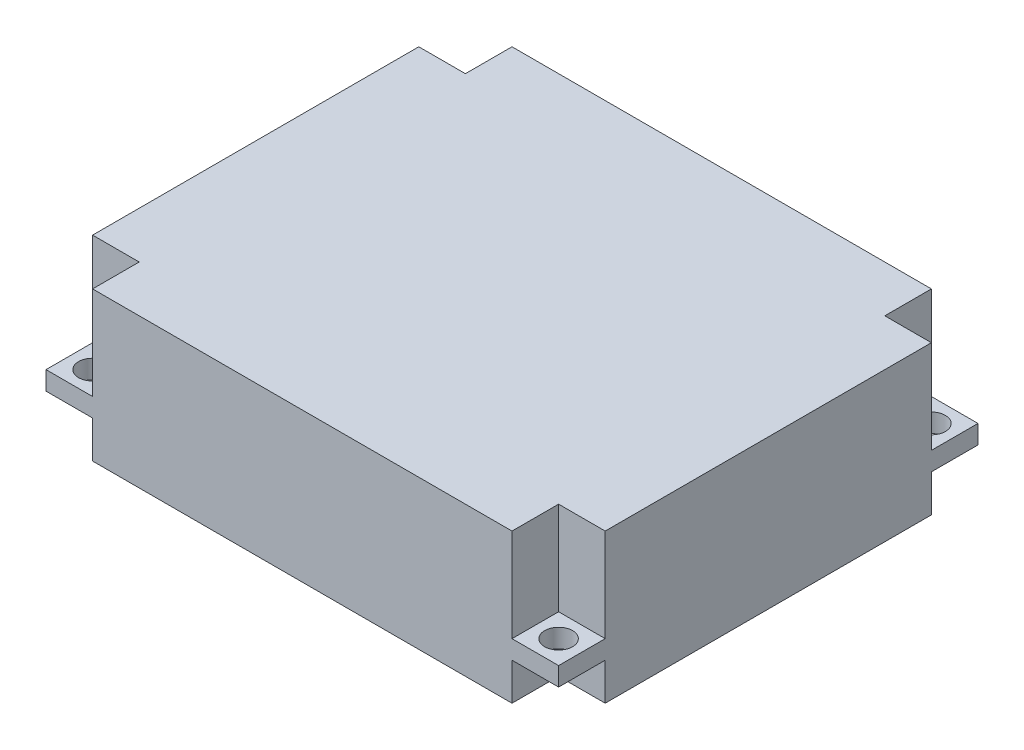
ISO-10303-21;
HEADER;
FILE_DESCRIPTION(('STEP AP214'),'2;1');
FILE_NAME('part.step','',(''),(''),'','','');
FILE_SCHEMA(('AUTOMOTIVE_DESIGN { 1 0 10303 214 1 1 1 1 }'));
ENDSEC;
DATA;
#1=APPLICATION_CONTEXT('core data for automotive mechanical design processes');
#2=APPLICATION_PROTOCOL_DEFINITION('international standard','automotive_design',2000,#1);
#3=PRODUCT_CONTEXT('',#1,'mechanical');
#4=PRODUCT('Part','Part','',(#3));
#5=PRODUCT_RELATED_PRODUCT_CATEGORY('part','',(#4));
#6=PRODUCT_DEFINITION_FORMATION('','',#4);
#7=PRODUCT_DEFINITION_CONTEXT('part definition',#1,'design');
#8=PRODUCT_DEFINITION('design','',#6,#7);
#9=PRODUCT_DEFINITION_SHAPE('','',#8);
#10=(LENGTH_UNIT() NAMED_UNIT(*) SI_UNIT(.MILLI.,.METRE.));
#11=(NAMED_UNIT(*) PLANE_ANGLE_UNIT() SI_UNIT($,.RADIAN.));
#12=(NAMED_UNIT(*) SI_UNIT($,.STERADIAN.) SOLID_ANGLE_UNIT());
#13=UNCERTAINTY_MEASURE_WITH_UNIT(LENGTH_MEASURE(1.E-05),#10,'distance_accuracy_value','');
#14=(GEOMETRIC_REPRESENTATION_CONTEXT(3) GLOBAL_UNCERTAINTY_ASSIGNED_CONTEXT((#13)) GLOBAL_UNIT_ASSIGNED_CONTEXT((#10,
#11,#12)) REPRESENTATION_CONTEXT('',''));
#15=CARTESIAN_POINT('',(0.,0.,0.));
#16=DIRECTION('',(0.,0.,1.));
#17=DIRECTION('',(1.,0.,0.));
#18=AXIS2_PLACEMENT_3D('',#15,#16,#17);
#19=CARTESIAN_POINT('',(0.,2.,0.));
#20=DIRECTION('',(0.,1.,0.));
#21=DIRECTION('',(0.,0.,1.));
#22=AXIS2_PLACEMENT_3D('',#19,#20,#21);
#23=PLANE('',#22);
#24=DIRECTION('',(-1.,0.,0.));
#25=VECTOR('',#24,1.);
#26=CARTESIAN_POINT('',(0.,2.,-17.5));
#27=LINE('',#26,#25);
#28=CARTESIAN_POINT('',(-22.5,2.,-17.5));
#29=VERTEX_POINT('',#28);
#30=CARTESIAN_POINT('',(-27.5,2.,-17.5));
#31=VERTEX_POINT('',#30);
#32=EDGE_CURVE('E54',#29,#31,#27,.T.);
#33=ORIENTED_EDGE('',*,*,#32,.F.);
#34=DIRECTION('',(0.,0.,1.));
#35=VECTOR('',#34,1.);
#36=CARTESIAN_POINT('',(-22.5,2.,0.));
#37=LINE('',#36,#35);
#38=CARTESIAN_POINT('',(-22.5,2.,-22.5));
#39=VERTEX_POINT('',#38);
#40=EDGE_CURVE('E367',#39,#29,#37,.T.);
#41=ORIENTED_EDGE('',*,*,#40,.F.);
#42=DIRECTION('',(-1.,0.,0.));
#43=VECTOR('',#42,1.);
#44=CARTESIAN_POINT('',(-27.5,2.,-22.5));
#45=LINE('',#44,#43);
#46=CARTESIAN_POINT('',(-27.5,2.,-22.5));
#47=VERTEX_POINT('',#46);
#48=EDGE_CURVE('E403',#39,#47,#45,.T.);
#49=ORIENTED_EDGE('',*,*,#48,.T.);
#50=DIRECTION('',(0.,0.,1.));
#51=VECTOR('',#50,1.);
#52=CARTESIAN_POINT('',(-27.5,2.,-22.5));
#53=LINE('',#52,#51);
#54=EDGE_CURVE('E395',#47,#31,#53,.T.);
#55=ORIENTED_EDGE('',*,*,#54,.T.);
#56=EDGE_LOOP('',(#33,#41,#49,#55));
#57=FACE_BOUND('',#56,.T.);
#58=CARTESIAN_POINT('',(-25.,2.,-20.));
#59=DIRECTION('',(0.,1.,0.));
#60=DIRECTION('',(0.,0.,1.));
#61=AXIS2_PLACEMENT_3D('',#58,#59,#60);
#62=CIRCLE('',#61,1.5);
#63=CARTESIAN_POINT('',(-25.,2.,-18.5));
#64=VERTEX_POINT('',#63);
#65=EDGE_CURVE('E391',#64,#64,#62,.T.);
#66=ORIENTED_EDGE('',*,*,#65,.F.);
#67=EDGE_LOOP('',(#66));
#68=FACE_BOUND('',#67,.T.);
#69=ADVANCED_FACE('F39',(#57,#68),#23,.T.);
#70=DIRECTION('',(0.,0.,-1.));
#71=VECTOR('',#70,1.);
#72=CARTESIAN_POINT('',(22.5,2.,0.));
#73=LINE('',#72,#71);
#74=CARTESIAN_POINT('',(22.5,2.,-17.5));
#75=VERTEX_POINT('',#74);
#76=CARTESIAN_POINT('',(22.5,2.,-22.5));
#77=VERTEX_POINT('',#76);
#78=EDGE_CURVE('E62',#75,#77,#73,.T.);
#79=ORIENTED_EDGE('',*,*,#78,.F.);
#80=DIRECTION('',(-1.,0.,0.));
#81=VECTOR('',#80,1.);
#82=CARTESIAN_POINT('',(0.,2.,-17.5));
#83=LINE('',#82,#81);
#84=CARTESIAN_POINT('',(27.5,2.,-17.5));
#85=VERTEX_POINT('',#84);
#86=EDGE_CURVE('E364',#85,#75,#83,.T.);
#87=ORIENTED_EDGE('',*,*,#86,.F.);
#88=DIRECTION('',(0.,0.,-1.));
#89=VECTOR('',#88,1.);
#90=CARTESIAN_POINT('',(27.5,2.,-22.5));
#91=LINE('',#90,#89);
#92=CARTESIAN_POINT('',(27.5,2.,-22.5));
#93=VERTEX_POINT('',#92);
#94=EDGE_CURVE('E400',#85,#93,#91,.T.);
#95=ORIENTED_EDGE('',*,*,#94,.T.);
#96=EDGE_CURVE('E404',#93,#77,#45,.T.);
#97=ORIENTED_EDGE('',*,*,#96,.T.);
#98=EDGE_LOOP('',(#79,#87,#95,#97));
#99=FACE_BOUND('',#98,.T.);
#100=CARTESIAN_POINT('',(25.,2.,-20.));
#101=DIRECTION('',(0.,1.,0.));
#102=DIRECTION('',(0.,0.,1.));
#103=AXIS2_PLACEMENT_3D('',#100,#101,#102);
#104=CIRCLE('',#103,1.5);
#105=CARTESIAN_POINT('',(25.,2.,-18.5));
#106=VERTEX_POINT('',#105);
#107=EDGE_CURVE('E385',#106,#106,#104,.T.);
#108=ORIENTED_EDGE('',*,*,#107,.F.);
#109=EDGE_LOOP('',(#108));
#110=FACE_BOUND('',#109,.T.);
#111=ADVANCED_FACE('F483',(#99,#110),#23,.T.);
#112=DIRECTION('',(1.,0.,0.));
#113=VECTOR('',#112,1.);
#114=CARTESIAN_POINT('',(0.,2.,17.5));
#115=LINE('',#114,#113);
#116=CARTESIAN_POINT('',(22.5,2.,17.5));
#117=VERTEX_POINT('',#116);
#118=CARTESIAN_POINT('',(27.5,2.,17.5));
#119=VERTEX_POINT('',#118);
#120=EDGE_CURVE('E361',#117,#119,#115,.T.);
#121=ORIENTED_EDGE('',*,*,#120,.F.);
#122=DIRECTION('',(0.,0.,-1.));
#123=VECTOR('',#122,1.);
#124=CARTESIAN_POINT('',(22.5,2.,0.));
#125=LINE('',#124,#123);
#126=CARTESIAN_POINT('',(22.5,2.,22.5));
#127=VERTEX_POINT('',#126);
#128=EDGE_CURVE('E358',#127,#117,#125,.T.);
#129=ORIENTED_EDGE('',*,*,#128,.F.);
#130=DIRECTION('',(1.,0.,0.));
#131=VECTOR('',#130,1.);
#132=CARTESIAN_POINT('',(-27.5,2.,22.5));
#133=LINE('',#132,#131);
#134=CARTESIAN_POINT('',(27.5,2.,22.5));
#135=VERTEX_POINT('',#134);
#136=EDGE_CURVE('E397',#127,#135,#133,.T.);
#137=ORIENTED_EDGE('',*,*,#136,.T.);
#138=EDGE_CURVE('E401',#135,#119,#91,.T.);
#139=ORIENTED_EDGE('',*,*,#138,.T.);
#140=EDGE_LOOP('',(#121,#129,#137,#139));
#141=FACE_BOUND('',#140,.T.);
#142=CARTESIAN_POINT('',(25.,2.,20.));
#143=DIRECTION('',(0.,1.,0.));
#144=DIRECTION('',(0.,0.,1.));
#145=AXIS2_PLACEMENT_3D('',#142,#143,#144);
#146=CIRCLE('',#145,1.5);
#147=CARTESIAN_POINT('',(25.,2.,21.5));
#148=VERTEX_POINT('',#147);
#149=EDGE_CURVE('E382',#148,#148,#146,.T.);
#150=ORIENTED_EDGE('',*,*,#149,.F.);
#151=EDGE_LOOP('',(#150));
#152=FACE_BOUND('',#151,.T.);
#153=ADVANCED_FACE('F501',(#141,#152),#23,.T.);
#154=CARTESIAN_POINT('',(0.,0.,0.));
#155=DIRECTION('',(0.,1.,0.));
#156=DIRECTION('',(0.,0.,1.));
#157=AXIS2_PLACEMENT_3D('',#154,#155,#156);
#158=PLANE('',#157);
#159=CARTESIAN_POINT('',(-25.,0.,-20.));
#160=DIRECTION('',(0.,1.,0.));
#161=DIRECTION('',(0.,0.,1.));
#162=AXIS2_PLACEMENT_3D('',#159,#160,#161);
#163=CIRCLE('',#162,1.5);
#164=CARTESIAN_POINT('',(-25.,0.,-18.5));
#165=VERTEX_POINT('',#164);
#166=EDGE_CURVE('E388',#165,#165,#163,.T.);
#167=ORIENTED_EDGE('',*,*,#166,.T.);
#168=EDGE_LOOP('',(#167));
#169=FACE_BOUND('',#168,.T.);
#170=DIRECTION('',(0.,0.,1.));
#171=VECTOR('',#170,1.);
#172=CARTESIAN_POINT('',(-22.5,0.,0.));
#173=LINE('',#172,#171);
#174=CARTESIAN_POINT('',(-22.5,0.,-22.5));
#175=VERTEX_POINT('',#174);
#176=CARTESIAN_POINT('',(-22.5,0.,-17.5));
#177=VERTEX_POINT('',#176);
#178=EDGE_CURVE('E47',#175,#177,#173,.T.);
#179=ORIENTED_EDGE('',*,*,#178,.T.);
#180=DIRECTION('',(-1.,0.,0.));
#181=VECTOR('',#180,1.);
#182=CARTESIAN_POINT('',(0.,0.,-17.5));
#183=LINE('',#182,#181);
#184=CARTESIAN_POINT('',(-27.5,0.,-17.5));
#185=VERTEX_POINT('',#184);
#186=EDGE_CURVE('E11',#177,#185,#183,.T.);
#187=ORIENTED_EDGE('',*,*,#186,.T.);
#188=DIRECTION('',(0.,0.,1.));
#189=VECTOR('',#188,1.);
#190=CARTESIAN_POINT('',(-27.5,0.,-22.5));
#191=LINE('',#190,#189);
#192=CARTESIAN_POINT('',(-27.5,0.,-22.5));
#193=VERTEX_POINT('',#192);
#194=EDGE_CURVE('E407',#193,#185,#191,.T.);
#195=ORIENTED_EDGE('',*,*,#194,.F.);
#196=DIRECTION('',(-1.,0.,0.));
#197=VECTOR('',#196,1.);
#198=CARTESIAN_POINT('',(-27.5,0.,-22.5));
#199=LINE('',#198,#197);
#200=EDGE_CURVE('E418',#175,#193,#199,.T.);
#201=ORIENTED_EDGE('',*,*,#200,.F.);
#202=EDGE_LOOP('',(#179,#187,#195,#201));
#203=FACE_BOUND('',#202,.T.);
#204=ADVANCED_FACE('F453',(#169,#203),#158,.F.);
#205=CARTESIAN_POINT('',(25.,0.,-20.));
#206=DIRECTION('',(0.,1.,0.));
#207=DIRECTION('',(0.,0.,1.));
#208=AXIS2_PLACEMENT_3D('',#205,#206,#207);
#209=CIRCLE('',#208,1.5);
#210=CARTESIAN_POINT('',(25.,0.,-18.5));
#211=VERTEX_POINT('',#210);
#212=EDGE_CURVE('E371',#211,#211,#209,.T.);
#213=ORIENTED_EDGE('',*,*,#212,.T.);
#214=EDGE_LOOP('',(#213));
#215=FACE_BOUND('',#214,.T.);
#216=DIRECTION('',(-1.,0.,0.));
#217=VECTOR('',#216,1.);
#218=CARTESIAN_POINT('',(0.,0.,-17.5));
#219=LINE('',#218,#217);
#220=CARTESIAN_POINT('',(27.5,0.,-17.5));
#221=VERTEX_POINT('',#220);
#222=CARTESIAN_POINT('',(22.5,0.,-17.5));
#223=VERTEX_POINT('',#222);
#224=EDGE_CURVE('E445',#221,#223,#219,.T.);
#225=ORIENTED_EDGE('',*,*,#224,.T.);
#226=DIRECTION('',(0.,0.,-1.));
#227=VECTOR('',#226,1.);
#228=CARTESIAN_POINT('',(22.5,0.,0.));
#229=LINE('',#228,#227);
#230=CARTESIAN_POINT('',(22.5,0.,-22.5));
#231=VERTEX_POINT('',#230);
#232=EDGE_CURVE('E448',#223,#231,#229,.T.);
#233=ORIENTED_EDGE('',*,*,#232,.T.);
#234=CARTESIAN_POINT('',(27.5,0.,-22.5));
#235=VERTEX_POINT('',#234);
#236=EDGE_CURVE('E419',#235,#231,#199,.T.);
#237=ORIENTED_EDGE('',*,*,#236,.F.);
#238=DIRECTION('',(0.,0.,-1.));
#239=VECTOR('',#238,1.);
#240=CARTESIAN_POINT('',(27.5,0.,-22.5));
#241=LINE('',#240,#239);
#242=EDGE_CURVE('E414',#221,#235,#241,.T.);
#243=ORIENTED_EDGE('',*,*,#242,.F.);
#244=EDGE_LOOP('',(#225,#233,#237,#243));
#245=FACE_BOUND('',#244,.T.);
#246=ADVANCED_FACE('F474',(#215,#245),#158,.F.);
#247=CARTESIAN_POINT('',(25.,0.,20.));
#248=DIRECTION('',(0.,1.,0.));
#249=DIRECTION('',(0.,0.,1.));
#250=AXIS2_PLACEMENT_3D('',#247,#248,#249);
#251=CIRCLE('',#250,1.5);
#252=CARTESIAN_POINT('',(25.,0.,21.5));
#253=VERTEX_POINT('',#252);
#254=EDGE_CURVE('E375',#253,#253,#251,.T.);
#255=ORIENTED_EDGE('',*,*,#254,.T.);
#256=EDGE_LOOP('',(#255));
#257=FACE_BOUND('',#256,.T.);
#258=DIRECTION('',(0.,0.,-1.));
#259=VECTOR('',#258,1.);
#260=CARTESIAN_POINT('',(22.5,0.,0.));
#261=LINE('',#260,#259);
#262=CARTESIAN_POINT('',(22.5,0.,22.5));
#263=VERTEX_POINT('',#262);
#264=CARTESIAN_POINT('',(22.5,0.,17.5));
#265=VERTEX_POINT('',#264);
#266=EDGE_CURVE('E439',#263,#265,#261,.T.);
#267=ORIENTED_EDGE('',*,*,#266,.T.);
#268=DIRECTION('',(1.,0.,0.));
#269=VECTOR('',#268,1.);
#270=CARTESIAN_POINT('',(0.,0.,17.5));
#271=LINE('',#270,#269);
#272=CARTESIAN_POINT('',(27.5,0.,17.5));
#273=VERTEX_POINT('',#272);
#274=EDGE_CURVE('E442',#265,#273,#271,.T.);
#275=ORIENTED_EDGE('',*,*,#274,.T.);
#276=CARTESIAN_POINT('',(27.5,0.,22.5));
#277=VERTEX_POINT('',#276);
#278=EDGE_CURVE('E415',#277,#273,#241,.T.);
#279=ORIENTED_EDGE('',*,*,#278,.F.);
#280=DIRECTION('',(1.,0.,0.));
#281=VECTOR('',#280,1.);
#282=CARTESIAN_POINT('',(-27.5,0.,22.5));
#283=LINE('',#282,#281);
#284=EDGE_CURVE('E410',#263,#277,#283,.T.);
#285=ORIENTED_EDGE('',*,*,#284,.F.);
#286=EDGE_LOOP('',(#267,#275,#279,#285));
#287=FACE_BOUND('',#286,.T.);
#288=ADVANCED_FACE('F560',(#257,#287),#158,.F.);
#289=CARTESIAN_POINT('',(-27.5,2.,-22.5));
#290=DIRECTION('',(1.,0.,0.));
#291=DIRECTION('',(0.,0.,-1.));
#292=AXIS2_PLACEMENT_3D('',#289,#290,#291);
#293=PLANE('',#292);
#294=CARTESIAN_POINT('',(-27.5,2.,17.5));
#295=VERTEX_POINT('',#294);
#296=CARTESIAN_POINT('',(-27.5,2.,22.5));
#297=VERTEX_POINT('',#296);
#298=EDGE_CURVE('E231',#295,#297,#53,.T.);
#299=ORIENTED_EDGE('',*,*,#298,.F.);
#300=DIRECTION('',(0.,1.,0.));
#301=VECTOR('',#300,1.);
#302=CARTESIAN_POINT('',(-27.5,-4.,17.5));
#303=LINE('',#302,#301);
#304=CARTESIAN_POINT('',(-27.5,12.,17.5));
#305=VERTEX_POINT('',#304);
#306=EDGE_CURVE('E225',#295,#305,#303,.T.);
#307=ORIENTED_EDGE('',*,*,#306,.T.);
#308=DIRECTION('',(0.,0.,1.));
#309=VECTOR('',#308,1.);
#310=CARTESIAN_POINT('',(-27.5,12.,17.5));
#311=LINE('',#310,#309);
#312=CARTESIAN_POINT('',(-27.5,12.,-17.5));
#313=VERTEX_POINT('',#312);
#314=EDGE_CURVE('E229',#313,#305,#311,.T.);
#315=ORIENTED_EDGE('',*,*,#314,.F.);
#316=DIRECTION('',(0.,1.,0.));
#317=VECTOR('',#316,1.);
#318=CARTESIAN_POINT('',(-27.5,-4.,-17.5));
#319=LINE('',#318,#317);
#320=EDGE_CURVE('E317',#31,#313,#319,.T.);
#321=ORIENTED_EDGE('',*,*,#320,.F.);
#322=ORIENTED_EDGE('',*,*,#54,.F.);
#323=DIRECTION('',(0.,-1.,0.));
#324=VECTOR('',#323,1.);
#325=CARTESIAN_POINT('',(-27.5,2.,-22.5));
#326=LINE('',#325,#324);
#327=EDGE_CURVE('E406',#47,#193,#326,.T.);
#328=ORIENTED_EDGE('',*,*,#327,.T.);
#329=ORIENTED_EDGE('',*,*,#194,.T.);
#330=CARTESIAN_POINT('',(-27.5,-4.,-17.5));
#331=VERTEX_POINT('',#330);
#332=EDGE_CURVE('E314',#331,#185,#319,.T.);
#333=ORIENTED_EDGE('',*,*,#332,.F.);
#334=DIRECTION('',(0.,0.,1.));
#335=VECTOR('',#334,1.);
#336=CARTESIAN_POINT('',(-27.5,-4.,17.5));
#337=LINE('',#336,#335);
#338=CARTESIAN_POINT('',(-27.5,-4.,17.5));
#339=VERTEX_POINT('',#338);
#340=EDGE_CURVE('E279',#331,#339,#337,.T.);
#341=ORIENTED_EDGE('',*,*,#340,.T.);
#342=CARTESIAN_POINT('',(-27.5,0.,17.5));
#343=VERTEX_POINT('',#342);
#344=EDGE_CURVE('E234',#339,#343,#303,.T.);
#345=ORIENTED_EDGE('',*,*,#344,.T.);
#346=CARTESIAN_POINT('',(-27.5,0.,22.5));
#347=VERTEX_POINT('',#346);
#348=EDGE_CURVE('E394',#343,#347,#191,.T.);
#349=ORIENTED_EDGE('',*,*,#348,.T.);
#350=DIRECTION('',(0.,-1.,0.));
#351=VECTOR('',#350,1.);
#352=CARTESIAN_POINT('',(-27.5,2.,22.5));
#353=LINE('',#352,#351);
#354=EDGE_CURVE('E430',#297,#347,#353,.T.);
#355=ORIENTED_EDGE('',*,*,#354,.F.);
#356=EDGE_LOOP('',(#299,#307,#315,#321,#322,#328,#329,#333,#341,#345,#349,#355));
#357=FACE_BOUND('',#356,.T.);
#358=ADVANCED_FACE('F41',(#357),#293,.F.);
#359=CARTESIAN_POINT('',(-27.5,2.,22.5));
#360=DIRECTION('',(0.,0.,-1.));
#361=DIRECTION('',(-1.,0.,0.));
#362=AXIS2_PLACEMENT_3D('',#359,#360,#361);
#363=PLANE('',#362);
#364=CARTESIAN_POINT('',(-22.5,0.,22.5));
#365=VERTEX_POINT('',#364);
#366=EDGE_CURVE('E411',#347,#365,#283,.T.);
#367=ORIENTED_EDGE('',*,*,#366,.T.);
#368=DIRECTION('',(0.,1.,0.));
#369=VECTOR('',#368,1.);
#370=CARTESIAN_POINT('',(-22.5,-4.,22.5));
#371=LINE('',#370,#369);
#372=CARTESIAN_POINT('',(-22.5,-4.,22.5));
#373=VERTEX_POINT('',#372);
#374=EDGE_CURVE('E348',#373,#365,#371,.T.);
#375=ORIENTED_EDGE('',*,*,#374,.F.);
#376=DIRECTION('',(1.,0.,0.));
#377=VECTOR('',#376,1.);
#378=CARTESIAN_POINT('',(22.5,-4.,22.5));
#379=LINE('',#378,#377);
#380=CARTESIAN_POINT('',(22.5,-4.,22.5));
#381=VERTEX_POINT('',#380);
#382=EDGE_CURVE('E288',#373,#381,#379,.T.);
#383=ORIENTED_EDGE('',*,*,#382,.T.);
#384=DIRECTION('',(0.,1.,0.));
#385=VECTOR('',#384,1.);
#386=CARTESIAN_POINT('',(22.5,-4.,22.5));
#387=LINE('',#386,#385);
#388=EDGE_CURVE('E344',#381,#263,#387,.T.);
#389=ORIENTED_EDGE('',*,*,#388,.T.);
#390=ORIENTED_EDGE('',*,*,#284,.T.);
#391=DIRECTION('',(0.,-1.,0.));
#392=VECTOR('',#391,1.);
#393=CARTESIAN_POINT('',(27.5,2.,22.5));
#394=LINE('',#393,#392);
#395=EDGE_CURVE('E427',#135,#277,#394,.T.);
#396=ORIENTED_EDGE('',*,*,#395,.F.);
#397=ORIENTED_EDGE('',*,*,#136,.F.);
#398=CARTESIAN_POINT('',(22.5,12.,22.5));
#399=VERTEX_POINT('',#398);
#400=EDGE_CURVE('E347',#127,#399,#387,.T.);
#401=ORIENTED_EDGE('',*,*,#400,.T.);
#402=DIRECTION('',(1.,0.,0.));
#403=VECTOR('',#402,1.);
#404=CARTESIAN_POINT('',(22.5,12.,22.5));
#405=LINE('',#404,#403);
#406=CARTESIAN_POINT('',(-22.5,12.,22.5));
#407=VERTEX_POINT('',#406);
#408=EDGE_CURVE('E255',#407,#399,#405,.T.);
#409=ORIENTED_EDGE('',*,*,#408,.F.);
#410=CARTESIAN_POINT('',(-22.5,2.,22.5));
#411=VERTEX_POINT('',#410);
#412=EDGE_CURVE('E350',#411,#407,#371,.T.);
#413=ORIENTED_EDGE('',*,*,#412,.F.);
#414=EDGE_CURVE('E398',#297,#411,#133,.T.);
#415=ORIENTED_EDGE('',*,*,#414,.F.);
#416=ORIENTED_EDGE('',*,*,#354,.T.);
#417=EDGE_LOOP('',(#367,#375,#383,#389,#390,#396,#397,#401,#409,#413,#415,#416));
#418=FACE_BOUND('',#417,.T.);
#419=ADVANCED_FACE('F510',(#418),#363,.F.);
#420=CARTESIAN_POINT('',(27.5,2.,-22.5));
#421=DIRECTION('',(-1.,0.,0.));
#422=DIRECTION('',(0.,0.,1.));
#423=AXIS2_PLACEMENT_3D('',#420,#421,#422);
#424=PLANE('',#423);
#425=ORIENTED_EDGE('',*,*,#278,.T.);
#426=DIRECTION('',(0.,1.,0.));
#427=VECTOR('',#426,1.);
#428=CARTESIAN_POINT('',(27.5,-4.,17.5));
#429=LINE('',#428,#427);
#430=CARTESIAN_POINT('',(27.5,-4.,17.5));
#431=VERTEX_POINT('',#430);
#432=EDGE_CURVE('E337',#431,#273,#429,.T.);
#433=ORIENTED_EDGE('',*,*,#432,.F.);
#434=DIRECTION('',(0.,0.,-1.));
#435=VECTOR('',#434,1.);
#436=CARTESIAN_POINT('',(27.5,-4.,-17.5));
#437=LINE('',#436,#435);
#438=CARTESIAN_POINT('',(27.5,-4.,-17.5));
#439=VERTEX_POINT('',#438);
#440=EDGE_CURVE('E297',#431,#439,#437,.T.);
#441=ORIENTED_EDGE('',*,*,#440,.T.);
#442=DIRECTION('',(0.,1.,0.));
#443=VECTOR('',#442,1.);
#444=CARTESIAN_POINT('',(27.5,-4.,-17.5));
#445=LINE('',#444,#443);
#446=EDGE_CURVE('E333',#439,#221,#445,.T.);
#447=ORIENTED_EDGE('',*,*,#446,.T.);
#448=ORIENTED_EDGE('',*,*,#242,.T.);
#449=DIRECTION('',(0.,-1.,0.));
#450=VECTOR('',#449,1.);
#451=CARTESIAN_POINT('',(27.5,2.,-22.5));
#452=LINE('',#451,#450);
#453=EDGE_CURVE('E424',#93,#235,#452,.T.);
#454=ORIENTED_EDGE('',*,*,#453,.F.);
#455=ORIENTED_EDGE('',*,*,#94,.F.);
#456=CARTESIAN_POINT('',(27.5,12.,-17.5));
#457=VERTEX_POINT('',#456);
#458=EDGE_CURVE('E336',#85,#457,#445,.T.);
#459=ORIENTED_EDGE('',*,*,#458,.T.);
#460=DIRECTION('',(0.,0.,-1.));
#461=VECTOR('',#460,1.);
#462=CARTESIAN_POINT('',(27.5,12.,-17.5));
#463=LINE('',#462,#461);
#464=CARTESIAN_POINT('',(27.5,12.,17.5));
#465=VERTEX_POINT('',#464);
#466=EDGE_CURVE('E264',#465,#457,#463,.T.);
#467=ORIENTED_EDGE('',*,*,#466,.F.);
#468=EDGE_CURVE('E339',#119,#465,#429,.T.);
#469=ORIENTED_EDGE('',*,*,#468,.F.);
#470=ORIENTED_EDGE('',*,*,#138,.F.);
#471=ORIENTED_EDGE('',*,*,#395,.T.);
#472=EDGE_LOOP('',(#425,#433,#441,#447,#448,#454,#455,#459,#467,#469,#470,#471));
#473=FACE_BOUND('',#472,.T.);
#474=ADVANCED_FACE('F478',(#473),#424,.F.);
#475=CARTESIAN_POINT('',(-27.5,2.,-22.5));
#476=DIRECTION('',(0.,0.,1.));
#477=DIRECTION('',(1.,0.,0.));
#478=AXIS2_PLACEMENT_3D('',#475,#476,#477);
#479=PLANE('',#478);
#480=ORIENTED_EDGE('',*,*,#236,.T.);
#481=DIRECTION('',(0.,1.,0.));
#482=VECTOR('',#481,1.);
#483=CARTESIAN_POINT('',(22.5,-4.,-22.5));
#484=LINE('',#483,#482);
#485=CARTESIAN_POINT('',(22.5,-4.,-22.5));
#486=VERTEX_POINT('',#485);
#487=EDGE_CURVE('E326',#486,#231,#484,.T.);
#488=ORIENTED_EDGE('',*,*,#487,.F.);
#489=DIRECTION('',(-1.,0.,0.));
#490=VECTOR('',#489,1.);
#491=CARTESIAN_POINT('',(-22.5,-4.,-22.5));
#492=LINE('',#491,#490);
#493=CARTESIAN_POINT('',(-22.5,-4.,-22.5));
#494=VERTEX_POINT('',#493);
#495=EDGE_CURVE('E306',#486,#494,#492,.T.);
#496=ORIENTED_EDGE('',*,*,#495,.T.);
#497=DIRECTION('',(0.,1.,0.));
#498=VECTOR('',#497,1.);
#499=CARTESIAN_POINT('',(-22.5,-4.,-22.5));
#500=LINE('',#499,#498);
#501=EDGE_CURVE('E322',#494,#175,#500,.T.);
#502=ORIENTED_EDGE('',*,*,#501,.T.);
#503=ORIENTED_EDGE('',*,*,#200,.T.);
#504=ORIENTED_EDGE('',*,*,#327,.F.);
#505=ORIENTED_EDGE('',*,*,#48,.F.);
#506=CARTESIAN_POINT('',(-22.5,12.,-22.5));
#507=VERTEX_POINT('',#506);
#508=EDGE_CURVE('E325',#39,#507,#500,.T.);
#509=ORIENTED_EDGE('',*,*,#508,.T.);
#510=DIRECTION('',(-1.,0.,0.));
#511=VECTOR('',#510,1.);
#512=CARTESIAN_POINT('',(-22.5,12.,-22.5));
#513=LINE('',#512,#511);
#514=CARTESIAN_POINT('',(22.5,12.,-22.5));
#515=VERTEX_POINT('',#514);
#516=EDGE_CURVE('E273',#515,#507,#513,.T.);
#517=ORIENTED_EDGE('',*,*,#516,.F.);
#518=EDGE_CURVE('E328',#77,#515,#484,.T.);
#519=ORIENTED_EDGE('',*,*,#518,.F.);
#520=ORIENTED_EDGE('',*,*,#96,.F.);
#521=ORIENTED_EDGE('',*,*,#453,.T.);
#522=EDGE_LOOP('',(#480,#488,#496,#502,#503,#504,#505,#509,#517,#519,#520,#521));
#523=FACE_BOUND('',#522,.T.);
#524=ADVANCED_FACE('F459',(#523),#479,.F.);
#525=DIRECTION('',(0.,0.,1.));
#526=VECTOR('',#525,1.);
#527=CARTESIAN_POINT('',(-22.5,2.,0.));
#528=LINE('',#527,#526);
#529=CARTESIAN_POINT('',(-22.5,2.,17.5));
#530=VERTEX_POINT('',#529);
#531=EDGE_CURVE('E355',#530,#411,#528,.T.);
#532=ORIENTED_EDGE('',*,*,#531,.F.);
#533=DIRECTION('',(1.,0.,0.));
#534=VECTOR('',#533,1.);
#535=CARTESIAN_POINT('',(0.,2.,17.5));
#536=LINE('',#535,#534);
#537=EDGE_CURVE('E316',#295,#530,#536,.T.);
#538=ORIENTED_EDGE('',*,*,#537,.F.);
#539=ORIENTED_EDGE('',*,*,#298,.T.);
#540=ORIENTED_EDGE('',*,*,#414,.T.);
#541=EDGE_LOOP('',(#532,#538,#539,#540));
#542=FACE_BOUND('',#541,.T.);
#543=CARTESIAN_POINT('',(-25.,2.,20.));
#544=DIRECTION('',(0.,1.,0.));
#545=DIRECTION('',(0.,0.,1.));
#546=AXIS2_PLACEMENT_3D('',#543,#544,#545);
#547=CIRCLE('',#546,1.5);
#548=CARTESIAN_POINT('',(-25.,2.,21.5));
#549=VERTEX_POINT('',#548);
#550=EDGE_CURVE('E374',#549,#549,#547,.T.);
#551=ORIENTED_EDGE('',*,*,#550,.F.);
#552=EDGE_LOOP('',(#551));
#553=FACE_BOUND('',#552,.T.);
#554=ADVANCED_FACE('F546',(#542,#553),#23,.T.);
#555=CARTESIAN_POINT('',(-25.,0.,20.));
#556=DIRECTION('',(0.,1.,0.));
#557=DIRECTION('',(0.,0.,1.));
#558=AXIS2_PLACEMENT_3D('',#555,#556,#557);
#559=CIRCLE('',#558,1.5);
#560=CARTESIAN_POINT('',(-25.,0.,21.5));
#561=VERTEX_POINT('',#560);
#562=EDGE_CURVE('E370',#561,#561,#559,.T.);
#563=ORIENTED_EDGE('',*,*,#562,.T.);
#564=EDGE_LOOP('',(#563));
#565=FACE_BOUND('',#564,.T.);
#566=DIRECTION('',(1.,0.,0.));
#567=VECTOR('',#566,1.);
#568=CARTESIAN_POINT('',(0.,0.,17.5));
#569=LINE('',#568,#567);
#570=CARTESIAN_POINT('',(-22.5,0.,17.5));
#571=VERTEX_POINT('',#570);
#572=EDGE_CURVE('E433',#343,#571,#569,.T.);
#573=ORIENTED_EDGE('',*,*,#572,.T.);
#574=DIRECTION('',(0.,0.,1.));
#575=VECTOR('',#574,1.);
#576=CARTESIAN_POINT('',(-22.5,0.,0.));
#577=LINE('',#576,#575);
#578=EDGE_CURVE('E436',#571,#365,#577,.T.);
#579=ORIENTED_EDGE('',*,*,#578,.T.);
#580=ORIENTED_EDGE('',*,*,#366,.F.);
#581=ORIENTED_EDGE('',*,*,#348,.F.);
#582=EDGE_LOOP('',(#573,#579,#580,#581));
#583=FACE_BOUND('',#582,.T.);
#584=ADVANCED_FACE('F520',(#565,#583),#158,.F.);
#585=CARTESIAN_POINT('',(-25.,0.,-20.));
#586=DIRECTION('',(0.,1.,0.));
#587=DIRECTION('',(0.,0.,1.));
#588=AXIS2_PLACEMENT_3D('',#585,#586,#587);
#589=CYLINDRICAL_SURFACE('',#588,1.5);
#590=ORIENTED_EDGE('',*,*,#65,.T.);
#591=EDGE_LOOP('',(#590));
#592=FACE_BOUND('',#591,.T.);
#593=ORIENTED_EDGE('',*,*,#166,.F.);
#594=EDGE_LOOP('',(#593));
#595=FACE_BOUND('',#594,.T.);
#596=ADVANCED_FACE('F558',(#592,#595),#589,.F.);
#597=CARTESIAN_POINT('',(-25.,0.,20.));
#598=DIRECTION('',(0.,1.,0.));
#599=DIRECTION('',(0.,0.,1.));
#600=AXIS2_PLACEMENT_3D('',#597,#598,#599);
#601=CYLINDRICAL_SURFACE('',#600,1.5);
#602=ORIENTED_EDGE('',*,*,#550,.T.);
#603=EDGE_LOOP('',(#602));
#604=FACE_BOUND('',#603,.T.);
#605=ORIENTED_EDGE('',*,*,#562,.F.);
#606=EDGE_LOOP('',(#605));
#607=FACE_BOUND('',#606,.T.);
#608=ADVANCED_FACE('F679',(#604,#607),#601,.F.);
#609=CARTESIAN_POINT('',(25.,0.,20.));
#610=DIRECTION('',(0.,1.,0.));
#611=DIRECTION('',(0.,0.,1.));
#612=AXIS2_PLACEMENT_3D('',#609,#610,#611);
#613=CYLINDRICAL_SURFACE('',#612,1.5);
#614=ORIENTED_EDGE('',*,*,#149,.T.);
#615=EDGE_LOOP('',(#614));
#616=FACE_BOUND('',#615,.T.);
#617=ORIENTED_EDGE('',*,*,#254,.F.);
#618=EDGE_LOOP('',(#617));
#619=FACE_BOUND('',#618,.T.);
#620=ADVANCED_FACE('F673',(#616,#619),#613,.F.);
#621=CARTESIAN_POINT('',(25.,0.,-20.));
#622=DIRECTION('',(0.,1.,0.));
#623=DIRECTION('',(0.,0.,1.));
#624=AXIS2_PLACEMENT_3D('',#621,#622,#623);
#625=CYLINDRICAL_SURFACE('',#624,1.5);
#626=ORIENTED_EDGE('',*,*,#107,.T.);
#627=EDGE_LOOP('',(#626));
#628=FACE_BOUND('',#627,.T.);
#629=ORIENTED_EDGE('',*,*,#212,.F.);
#630=EDGE_LOOP('',(#629));
#631=FACE_BOUND('',#630,.T.);
#632=ADVANCED_FACE('F668',(#628,#631),#625,.F.);
#633=CARTESIAN_POINT('',(0.,-4.,0.));
#634=DIRECTION('',(0.,-1.,0.));
#635=DIRECTION('',(0.,0.,-1.));
#636=AXIS2_PLACEMENT_3D('',#633,#634,#635);
#637=PLANE('',#636);
#638=ORIENTED_EDGE('',*,*,#340,.F.);
#639=DIRECTION('',(-1.,0.,0.));
#640=VECTOR('',#639,1.);
#641=CARTESIAN_POINT('',(-27.5,-4.,-17.5));
#642=LINE('',#641,#640);
#643=CARTESIAN_POINT('',(-22.5,-4.,-17.5));
#644=VERTEX_POINT('',#643);
#645=EDGE_CURVE('E235',#644,#331,#642,.T.);
#646=ORIENTED_EDGE('',*,*,#645,.F.);
#647=DIRECTION('',(0.,0.,1.));
#648=VECTOR('',#647,1.);
#649=CARTESIAN_POINT('',(-22.5,-4.,-17.5));
#650=LINE('',#649,#648);
#651=EDGE_CURVE('E309',#494,#644,#650,.T.);
#652=ORIENTED_EDGE('',*,*,#651,.F.);
#653=ORIENTED_EDGE('',*,*,#495,.F.);
#654=DIRECTION('',(0.,0.,-1.));
#655=VECTOR('',#654,1.);
#656=CARTESIAN_POINT('',(22.5,-4.,-22.5));
#657=LINE('',#656,#655);
#658=CARTESIAN_POINT('',(22.5,-4.,-17.5));
#659=VERTEX_POINT('',#658);
#660=EDGE_CURVE('E303',#659,#486,#657,.T.);
#661=ORIENTED_EDGE('',*,*,#660,.F.);
#662=DIRECTION('',(-1.,0.,0.));
#663=VECTOR('',#662,1.);
#664=CARTESIAN_POINT('',(22.5,-4.,-17.5));
#665=LINE('',#664,#663);
#666=EDGE_CURVE('E300',#439,#659,#665,.T.);
#667=ORIENTED_EDGE('',*,*,#666,.F.);
#668=ORIENTED_EDGE('',*,*,#440,.F.);
#669=DIRECTION('',(1.,0.,0.));
#670=VECTOR('',#669,1.);
#671=CARTESIAN_POINT('',(27.5,-4.,17.5));
#672=LINE('',#671,#670);
#673=CARTESIAN_POINT('',(22.5,-4.,17.5));
#674=VERTEX_POINT('',#673);
#675=EDGE_CURVE('E294',#674,#431,#672,.T.);
#676=ORIENTED_EDGE('',*,*,#675,.F.);
#677=DIRECTION('',(0.,0.,-1.));
#678=VECTOR('',#677,1.);
#679=CARTESIAN_POINT('',(22.5,-4.,17.5));
#680=LINE('',#679,#678);
#681=EDGE_CURVE('E291',#381,#674,#680,.T.);
#682=ORIENTED_EDGE('',*,*,#681,.F.);
#683=ORIENTED_EDGE('',*,*,#382,.F.);
#684=DIRECTION('',(0.,0.,1.));
#685=VECTOR('',#684,1.);
#686=CARTESIAN_POINT('',(-22.5,-4.,22.5));
#687=LINE('',#686,#685);
#688=CARTESIAN_POINT('',(-22.5,-4.,17.5));
#689=VERTEX_POINT('',#688);
#690=EDGE_CURVE('E285',#689,#373,#687,.T.);
#691=ORIENTED_EDGE('',*,*,#690,.F.);
#692=DIRECTION('',(1.,0.,0.));
#693=VECTOR('',#692,1.);
#694=CARTESIAN_POINT('',(-22.5,-4.,17.5));
#695=LINE('',#694,#693);
#696=EDGE_CURVE('E282',#339,#689,#695,.T.);
#697=ORIENTED_EDGE('',*,*,#696,.F.);
#698=EDGE_LOOP('',(#638,#646,#652,#653,#661,#667,#668,#676,#682,#683,#691,#697));
#699=FACE_BOUND('',#698,.T.);
#700=ADVANCED_FACE('F465',(#699),#637,.T.);
#701=CARTESIAN_POINT('',(-22.5,-4.,17.5));
#702=DIRECTION('',(0.,0.,1.));
#703=DIRECTION('',(1.,0.,0.));
#704=AXIS2_PLACEMENT_3D('',#701,#702,#703);
#705=PLANE('',#704);
#706=ORIENTED_EDGE('',*,*,#572,.F.);
#707=ORIENTED_EDGE('',*,*,#344,.F.);
#708=ORIENTED_EDGE('',*,*,#696,.T.);
#709=DIRECTION('',(0.,1.,0.));
#710=VECTOR('',#709,1.);
#711=CARTESIAN_POINT('',(-22.5,-4.,17.5));
#712=LINE('',#711,#710);
#713=EDGE_CURVE('E351',#689,#571,#712,.T.);
#714=ORIENTED_EDGE('',*,*,#713,.T.);
#715=EDGE_LOOP('',(#706,#707,#708,#714));
#716=FACE_BOUND('',#715,.T.);
#717=ADVANCED_FACE('F530',(#716),#705,.T.);
#718=CARTESIAN_POINT('',(-22.5,-4.,22.5));
#719=DIRECTION('',(-1.,0.,0.));
#720=DIRECTION('',(0.,0.,1.));
#721=AXIS2_PLACEMENT_3D('',#718,#719,#720);
#722=PLANE('',#721);
#723=ORIENTED_EDGE('',*,*,#578,.F.);
#724=ORIENTED_EDGE('',*,*,#713,.F.);
#725=ORIENTED_EDGE('',*,*,#690,.T.);
#726=ORIENTED_EDGE('',*,*,#374,.T.);
#727=EDGE_LOOP('',(#723,#724,#725,#726));
#728=FACE_BOUND('',#727,.T.);
#729=ADVANCED_FACE('F528',(#728),#722,.T.);
#730=CARTESIAN_POINT('',(22.5,-4.,17.5));
#731=DIRECTION('',(1.,0.,0.));
#732=DIRECTION('',(0.,0.,-1.));
#733=AXIS2_PLACEMENT_3D('',#730,#731,#732);
#734=PLANE('',#733);
#735=ORIENTED_EDGE('',*,*,#266,.F.);
#736=ORIENTED_EDGE('',*,*,#388,.F.);
#737=ORIENTED_EDGE('',*,*,#681,.T.);
#738=DIRECTION('',(0.,1.,0.));
#739=VECTOR('',#738,1.);
#740=CARTESIAN_POINT('',(22.5,-4.,17.5));
#741=LINE('',#740,#739);
#742=EDGE_CURVE('E340',#674,#265,#741,.T.);
#743=ORIENTED_EDGE('',*,*,#742,.T.);
#744=EDGE_LOOP('',(#735,#736,#737,#743));
#745=FACE_BOUND('',#744,.T.);
#746=ADVANCED_FACE('F589',(#745),#734,.T.);
#747=CARTESIAN_POINT('',(27.5,-4.,17.5));
#748=DIRECTION('',(0.,0.,1.));
#749=DIRECTION('',(1.,0.,0.));
#750=AXIS2_PLACEMENT_3D('',#747,#748,#749);
#751=PLANE('',#750);
#752=ORIENTED_EDGE('',*,*,#274,.F.);
#753=ORIENTED_EDGE('',*,*,#742,.F.);
#754=ORIENTED_EDGE('',*,*,#675,.T.);
#755=ORIENTED_EDGE('',*,*,#432,.T.);
#756=EDGE_LOOP('',(#752,#753,#754,#755));
#757=FACE_BOUND('',#756,.T.);
#758=ADVANCED_FACE('F592',(#757),#751,.T.);
#759=CARTESIAN_POINT('',(22.5,-4.,-17.5));
#760=DIRECTION('',(0.,0.,-1.));
#761=DIRECTION('',(-1.,0.,0.));
#762=AXIS2_PLACEMENT_3D('',#759,#760,#761);
#763=PLANE('',#762);
#764=ORIENTED_EDGE('',*,*,#224,.F.);
#765=ORIENTED_EDGE('',*,*,#446,.F.);
#766=ORIENTED_EDGE('',*,*,#666,.T.);
#767=DIRECTION('',(0.,1.,0.));
#768=VECTOR('',#767,1.);
#769=CARTESIAN_POINT('',(22.5,-4.,-17.5));
#770=LINE('',#769,#768);
#771=EDGE_CURVE('E329',#659,#223,#770,.T.);
#772=ORIENTED_EDGE('',*,*,#771,.T.);
#773=EDGE_LOOP('',(#764,#765,#766,#772));
#774=FACE_BOUND('',#773,.T.);
#775=ADVANCED_FACE('F471',(#774),#763,.T.);
#776=CARTESIAN_POINT('',(22.5,-4.,-22.5));
#777=DIRECTION('',(1.,0.,0.));
#778=DIRECTION('',(0.,0.,-1.));
#779=AXIS2_PLACEMENT_3D('',#776,#777,#778);
#780=PLANE('',#779);
#781=ORIENTED_EDGE('',*,*,#232,.F.);
#782=ORIENTED_EDGE('',*,*,#771,.F.);
#783=ORIENTED_EDGE('',*,*,#660,.T.);
#784=ORIENTED_EDGE('',*,*,#487,.T.);
#785=EDGE_LOOP('',(#781,#782,#783,#784));
#786=FACE_BOUND('',#785,.T.);
#787=ADVANCED_FACE('F469',(#786),#780,.T.);
#788=CARTESIAN_POINT('',(-22.5,-4.,-17.5));
#789=DIRECTION('',(-1.,0.,0.));
#790=DIRECTION('',(0.,0.,1.));
#791=AXIS2_PLACEMENT_3D('',#788,#789,#790);
#792=PLANE('',#791);
#793=ORIENTED_EDGE('',*,*,#178,.F.);
#794=ORIENTED_EDGE('',*,*,#501,.F.);
#795=ORIENTED_EDGE('',*,*,#651,.T.);
#796=DIRECTION('',(0.,1.,0.));
#797=VECTOR('',#796,1.);
#798=CARTESIAN_POINT('',(-22.5,-4.,-17.5));
#799=LINE('',#798,#797);
#800=EDGE_CURVE('E318',#644,#177,#799,.T.);
#801=ORIENTED_EDGE('',*,*,#800,.T.);
#802=EDGE_LOOP('',(#793,#794,#795,#801));
#803=FACE_BOUND('',#802,.T.);
#804=ADVANCED_FACE('F456',(#803),#792,.T.);
#805=CARTESIAN_POINT('',(-27.5,-4.,-17.5));
#806=DIRECTION('',(0.,0.,-1.));
#807=DIRECTION('',(-1.,0.,0.));
#808=AXIS2_PLACEMENT_3D('',#805,#806,#807);
#809=PLANE('',#808);
#810=ORIENTED_EDGE('',*,*,#186,.F.);
#811=ORIENTED_EDGE('',*,*,#800,.F.);
#812=ORIENTED_EDGE('',*,*,#645,.T.);
#813=ORIENTED_EDGE('',*,*,#332,.T.);
#814=EDGE_LOOP('',(#810,#811,#812,#813));
#815=FACE_BOUND('',#814,.T.);
#816=ADVANCED_FACE('F532',(#815),#809,.T.);
#817=CARTESIAN_POINT('',(-22.5,12.,-17.5));
#818=VERTEX_POINT('',#817);
#819=EDGE_CURVE('E321',#29,#818,#799,.T.);
#820=ORIENTED_EDGE('',*,*,#819,.F.);
#821=ORIENTED_EDGE('',*,*,#32,.T.);
#822=ORIENTED_EDGE('',*,*,#320,.T.);
#823=DIRECTION('',(-1.,0.,0.));
#824=VECTOR('',#823,1.);
#825=CARTESIAN_POINT('',(-27.5,12.,-17.5));
#826=LINE('',#825,#824);
#827=EDGE_CURVE('E251',#818,#313,#826,.T.);
#828=ORIENTED_EDGE('',*,*,#827,.F.);
#829=EDGE_LOOP('',(#820,#821,#822,#828));
#830=FACE_BOUND('',#829,.T.);
#831=ADVANCED_FACE('F534',(#830),#809,.T.);
#832=ORIENTED_EDGE('',*,*,#508,.F.);
#833=ORIENTED_EDGE('',*,*,#40,.T.);
#834=ORIENTED_EDGE('',*,*,#819,.T.);
#835=DIRECTION('',(0.,0.,1.));
#836=VECTOR('',#835,1.);
#837=CARTESIAN_POINT('',(-22.5,12.,-17.5));
#838=LINE('',#837,#836);
#839=EDGE_CURVE('E276',#507,#818,#838,.T.);
#840=ORIENTED_EDGE('',*,*,#839,.F.);
#841=EDGE_LOOP('',(#832,#833,#834,#840));
#842=FACE_BOUND('',#841,.T.);
#843=ADVANCED_FACE('F540',(#842),#792,.T.);
#844=CARTESIAN_POINT('',(22.5,12.,-17.5));
#845=VERTEX_POINT('',#844);
#846=EDGE_CURVE('E332',#75,#845,#770,.T.);
#847=ORIENTED_EDGE('',*,*,#846,.F.);
#848=ORIENTED_EDGE('',*,*,#78,.T.);
#849=ORIENTED_EDGE('',*,*,#518,.T.);
#850=DIRECTION('',(0.,0.,-1.));
#851=VECTOR('',#850,1.);
#852=CARTESIAN_POINT('',(22.5,12.,-22.5));
#853=LINE('',#852,#851);
#854=EDGE_CURVE('E270',#845,#515,#853,.T.);
#855=ORIENTED_EDGE('',*,*,#854,.F.);
#856=EDGE_LOOP('',(#847,#848,#849,#855));
#857=FACE_BOUND('',#856,.T.);
#858=ADVANCED_FACE('F487',(#857),#780,.T.);
#859=ORIENTED_EDGE('',*,*,#458,.F.);
#860=ORIENTED_EDGE('',*,*,#86,.T.);
#861=ORIENTED_EDGE('',*,*,#846,.T.);
#862=DIRECTION('',(-1.,0.,0.));
#863=VECTOR('',#862,1.);
#864=CARTESIAN_POINT('',(22.5,12.,-17.5));
#865=LINE('',#864,#863);
#866=EDGE_CURVE('E267',#457,#845,#865,.T.);
#867=ORIENTED_EDGE('',*,*,#866,.F.);
#868=EDGE_LOOP('',(#859,#860,#861,#867));
#869=FACE_BOUND('',#868,.T.);
#870=ADVANCED_FACE('F492',(#869),#763,.T.);
#871=CARTESIAN_POINT('',(22.5,12.,17.5));
#872=VERTEX_POINT('',#871);
#873=EDGE_CURVE('E343',#117,#872,#741,.T.);
#874=ORIENTED_EDGE('',*,*,#873,.F.);
#875=ORIENTED_EDGE('',*,*,#120,.T.);
#876=ORIENTED_EDGE('',*,*,#468,.T.);
#877=DIRECTION('',(1.,0.,0.));
#878=VECTOR('',#877,1.);
#879=CARTESIAN_POINT('',(27.5,12.,17.5));
#880=LINE('',#879,#878);
#881=EDGE_CURVE('E261',#872,#465,#880,.T.);
#882=ORIENTED_EDGE('',*,*,#881,.F.);
#883=EDGE_LOOP('',(#874,#875,#876,#882));
#884=FACE_BOUND('',#883,.T.);
#885=ADVANCED_FACE('F499',(#884),#751,.T.);
#886=ORIENTED_EDGE('',*,*,#400,.F.);
#887=ORIENTED_EDGE('',*,*,#128,.T.);
#888=ORIENTED_EDGE('',*,*,#873,.T.);
#889=DIRECTION('',(0.,0.,-1.));
#890=VECTOR('',#889,1.);
#891=CARTESIAN_POINT('',(22.5,12.,17.5));
#892=LINE('',#891,#890);
#893=EDGE_CURVE('E258',#399,#872,#892,.T.);
#894=ORIENTED_EDGE('',*,*,#893,.F.);
#895=EDGE_LOOP('',(#886,#887,#888,#894));
#896=FACE_BOUND('',#895,.T.);
#897=ADVANCED_FACE('F506',(#896),#734,.T.);
#898=CARTESIAN_POINT('',(-22.5,12.,17.5));
#899=VERTEX_POINT('',#898);
#900=EDGE_CURVE('E241',#530,#899,#712,.T.);
#901=ORIENTED_EDGE('',*,*,#900,.F.);
#902=ORIENTED_EDGE('',*,*,#531,.T.);
#903=ORIENTED_EDGE('',*,*,#412,.T.);
#904=DIRECTION('',(0.,0.,1.));
#905=VECTOR('',#904,1.);
#906=CARTESIAN_POINT('',(-22.5,12.,22.5));
#907=LINE('',#906,#905);
#908=EDGE_CURVE('E245',#899,#407,#907,.T.);
#909=ORIENTED_EDGE('',*,*,#908,.F.);
#910=EDGE_LOOP('',(#901,#902,#903,#909));
#911=FACE_BOUND('',#910,.T.);
#912=ADVANCED_FACE('F514',(#911),#722,.T.);
#913=ORIENTED_EDGE('',*,*,#306,.F.);
#914=ORIENTED_EDGE('',*,*,#537,.T.);
#915=ORIENTED_EDGE('',*,*,#900,.T.);
#916=DIRECTION('',(1.,0.,0.));
#917=VECTOR('',#916,1.);
#918=CARTESIAN_POINT('',(-22.5,12.,17.5));
#919=LINE('',#918,#917);
#920=EDGE_CURVE('E238',#305,#899,#919,.T.);
#921=ORIENTED_EDGE('',*,*,#920,.F.);
#922=EDGE_LOOP('',(#913,#914,#915,#921));
#923=FACE_BOUND('',#922,.T.);
#924=ADVANCED_FACE('F239',(#923),#705,.T.);
#925=CARTESIAN_POINT('',(0.,12.,0.));
#926=DIRECTION('',(0.,-1.,0.));
#927=DIRECTION('',(0.,0.,-1.));
#928=AXIS2_PLACEMENT_3D('',#925,#926,#927);
#929=PLANE('',#928);
#930=ORIENTED_EDGE('',*,*,#314,.T.);
#931=ORIENTED_EDGE('',*,*,#920,.T.);
#932=ORIENTED_EDGE('',*,*,#908,.T.);
#933=ORIENTED_EDGE('',*,*,#408,.T.);
#934=ORIENTED_EDGE('',*,*,#893,.T.);
#935=ORIENTED_EDGE('',*,*,#881,.T.);
#936=ORIENTED_EDGE('',*,*,#466,.T.);
#937=ORIENTED_EDGE('',*,*,#866,.T.);
#938=ORIENTED_EDGE('',*,*,#854,.T.);
#939=ORIENTED_EDGE('',*,*,#516,.T.);
#940=ORIENTED_EDGE('',*,*,#839,.T.);
#941=ORIENTED_EDGE('',*,*,#827,.T.);
#942=EDGE_LOOP('',(#930,#931,#932,#933,#934,#935,#936,#937,#938,#939,#940,#941));
#943=FACE_BOUND('',#942,.T.);
#944=ADVANCED_FACE('F248',(#943),#929,.F.);
#945=CLOSED_SHELL('',(#69,#111,#153,#204,#246,#288,#358,#419,#474,#524,#554,#584,#596,#608,#620,
#632,#700,#717,#729,#746,#758,#775,#787,#804,#816,#831,#843,#858,#870,#885,#897,#912,#924,#944));
#946=MANIFOLD_SOLID_BREP('B2',#945);
#947=ADVANCED_BREP_SHAPE_REPRESENTATION('',(#18,#946),#14);
#948=SHAPE_DEFINITION_REPRESENTATION(#9,#947);
ENDSEC;
END-ISO-10303-21;
